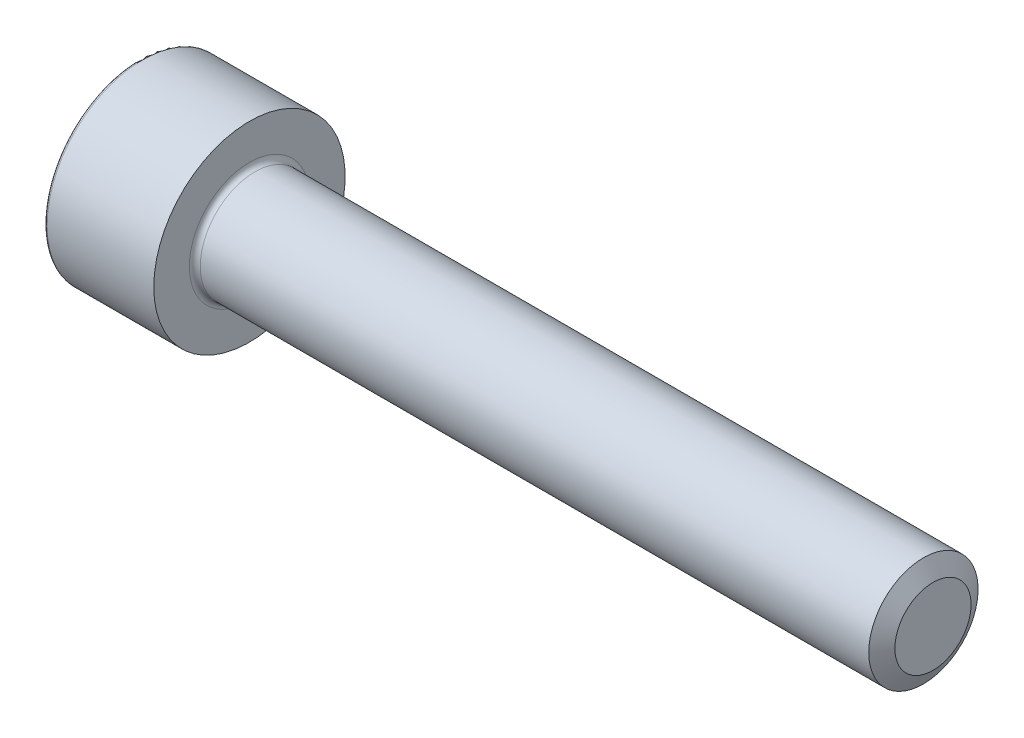
ISO-10303-21;
HEADER;
FILE_DESCRIPTION(('STEP AP214'),'2;1');
FILE_NAME('part.step','',(''),(''),'','','');
FILE_SCHEMA(('AUTOMOTIVE_DESIGN { 1 0 10303 214 1 1 1 1 }'));
ENDSEC;
DATA;
#1=APPLICATION_CONTEXT('core data for automotive mechanical design processes');
#2=APPLICATION_PROTOCOL_DEFINITION('international standard','automotive_design',2000,#1);
#3=PRODUCT_CONTEXT('',#1,'mechanical');
#4=PRODUCT('Part','Part','',(#3));
#5=PRODUCT_RELATED_PRODUCT_CATEGORY('part','',(#4));
#6=PRODUCT_DEFINITION_FORMATION('','',#4);
#7=PRODUCT_DEFINITION_CONTEXT('part definition',#1,'design');
#8=PRODUCT_DEFINITION('design','',#6,#7);
#9=PRODUCT_DEFINITION_SHAPE('','',#8);
#10=(LENGTH_UNIT() NAMED_UNIT(*) SI_UNIT(.MILLI.,.METRE.));
#11=(NAMED_UNIT(*) PLANE_ANGLE_UNIT() SI_UNIT($,.RADIAN.));
#12=(NAMED_UNIT(*) SI_UNIT($,.STERADIAN.) SOLID_ANGLE_UNIT());
#13=UNCERTAINTY_MEASURE_WITH_UNIT(LENGTH_MEASURE(1.E-05),#10,'distance_accuracy_value','');
#14=(GEOMETRIC_REPRESENTATION_CONTEXT(3) GLOBAL_UNCERTAINTY_ASSIGNED_CONTEXT((#13)) GLOBAL_UNIT_ASSIGNED_CONTEXT((#10,
#11,#12)) REPRESENTATION_CONTEXT('',''));
#15=CARTESIAN_POINT('',(0.,0.,0.));
#16=DIRECTION('',(0.,0.,1.));
#17=DIRECTION('',(1.,0.,0.));
#18=AXIS2_PLACEMENT_3D('',#15,#16,#17);
#19=CARTESIAN_POINT('',(0.,0.,0.));
#20=DIRECTION('',(-1.,0.,0.));
#21=DIRECTION('',(0.,0.,1.));
#22=AXIS2_PLACEMENT_3D('',#19,#20,#21);
#23=CYLINDRICAL_SURFACE('',#22,2.);
#24=CARTESIAN_POINT('',(4.2,0.,0.));
#25=DIRECTION('',(-1.,0.,0.));
#26=DIRECTION('',(0.,0.,1.));
#27=AXIS2_PLACEMENT_3D('',#24,#25,#26);
#28=CIRCLE('',#27,2.);
#29=CARTESIAN_POINT('',(4.2,0.,2.));
#30=VERTEX_POINT('',#29);
#31=EDGE_CURVE('E142',#30,#30,#28,.T.);
#32=ORIENTED_EDGE('',*,*,#31,.F.);
#33=EDGE_LOOP('',(#32));
#34=FACE_BOUND('',#33,.T.);
#35=CARTESIAN_POINT('',(28.6500102668172,0.,0.));
#36=DIRECTION('',(-1.,0.,0.));
#37=DIRECTION('',(0.,0.,1.));
#38=AXIS2_PLACEMENT_3D('',#35,#36,#37);
#39=CIRCLE('',#38,2.);
#40=CARTESIAN_POINT('',(28.6500102668172,0.,2.));
#41=VERTEX_POINT('',#40);
#42=EDGE_CURVE('E279',#41,#41,#39,.T.);
#43=ORIENTED_EDGE('',*,*,#42,.T.);
#44=EDGE_LOOP('',(#43));
#45=FACE_BOUND('',#44,.T.);
#46=ADVANCED_FACE('F39',(#34,#45),#23,.T.);
#47=CARTESIAN_POINT('',(0.,0.,0.));
#48=DIRECTION('',(1.,0.,0.));
#49=DIRECTION('',(0.,0.,-1.));
#50=AXIS2_PLACEMENT_3D('',#47,#48,#49);
#51=PLANE('',#50);
#52=CARTESIAN_POINT('',(0.,0.,0.));
#53=DIRECTION('',(1.,0.,0.));
#54=DIRECTION('',(0.,0.,-1.));
#55=AXIS2_PLACEMENT_3D('',#52,#53,#54);
#56=CIRCLE('',#55,3.4);
#57=CARTESIAN_POINT('',(0.,0.,-3.4));
#58=VERTEX_POINT('',#57);
#59=EDGE_CURVE('E47',#58,#58,#56,.F.);
#60=ORIENTED_EDGE('',*,*,#59,.T.);
#61=EDGE_LOOP('',(#60));
#62=FACE_BOUND('',#61,.T.);
#63=DIRECTION('',(0.,0.866025403784438,-0.5));
#64=VECTOR('',#63,1.);
#65=CARTESIAN_POINT('',(0.,0.,1.72));
#66=LINE('',#65,#64);
#67=CARTESIAN_POINT('',(0.,0.,1.72));
#68=VERTEX_POINT('',#67);
#69=CARTESIAN_POINT('',(0.,1.48956369450923,0.859999999999999));
#70=VERTEX_POINT('',#69);
#71=EDGE_CURVE('E128',#68,#70,#66,.T.);
#72=ORIENTED_EDGE('',*,*,#71,.F.);
#73=DIRECTION('',(0.,0.866025403784439,0.5));
#74=VECTOR('',#73,1.);
#75=CARTESIAN_POINT('',(0.,-1.48956369450923,0.86));
#76=LINE('',#75,#74);
#77=CARTESIAN_POINT('',(0.,-1.48956369450923,0.86));
#78=VERTEX_POINT('',#77);
#79=EDGE_CURVE('E54',#78,#68,#76,.T.);
#80=ORIENTED_EDGE('',*,*,#79,.F.);
#81=DIRECTION('',(0.,0.,1.));
#82=VECTOR('',#81,1.);
#83=CARTESIAN_POINT('',(0.,-1.48956369450923,-0.86));
#84=LINE('',#83,#82);
#85=CARTESIAN_POINT('',(0.,-1.48956369450923,-0.86));
#86=VERTEX_POINT('',#85);
#87=EDGE_CURVE('E138',#86,#78,#84,.T.);
#88=ORIENTED_EDGE('',*,*,#87,.F.);
#89=DIRECTION('',(0.,-0.866025403784438,0.5));
#90=VECTOR('',#89,1.);
#91=CARTESIAN_POINT('',(0.,0.,-1.72));
#92=LINE('',#91,#90);
#93=CARTESIAN_POINT('',(0.,0.,-1.72));
#94=VERTEX_POINT('',#93);
#95=EDGE_CURVE('E136',#94,#86,#92,.T.);
#96=ORIENTED_EDGE('',*,*,#95,.F.);
#97=DIRECTION('',(0.,-0.866025403784439,-0.5));
#98=VECTOR('',#97,1.);
#99=CARTESIAN_POINT('',(0.,1.48956369450923,-0.86));
#100=LINE('',#99,#98);
#101=CARTESIAN_POINT('',(0.,1.48956369450923,-0.86));
#102=VERTEX_POINT('',#101);
#103=EDGE_CURVE('E102',#102,#94,#100,.T.);
#104=ORIENTED_EDGE('',*,*,#103,.F.);
#105=DIRECTION('',(0.,0.,-1.));
#106=VECTOR('',#105,1.);
#107=CARTESIAN_POINT('',(0.,1.48956369450923,0.859999999999999));
#108=LINE('',#107,#106);
#109=EDGE_CURVE('E132',#70,#102,#108,.T.);
#110=ORIENTED_EDGE('',*,*,#109,.F.);
#111=EDGE_LOOP('',(#72,#80,#88,#96,#104,#110));
#112=FACE_BOUND('',#111,.T.);
#113=ADVANCED_FACE('F159',(#62,#112),#51,.F.);
#114=CARTESIAN_POINT('',(0.,0.,0.));
#115=DIRECTION('',(-1.,0.,0.));
#116=DIRECTION('',(0.,0.,1.));
#117=AXIS2_PLACEMENT_3D('',#114,#115,#116);
#118=CYLINDRICAL_SURFACE('',#117,3.5);
#119=CARTESIAN_POINT('',(0.1,0.,0.));
#120=DIRECTION('',(1.,0.,0.));
#121=DIRECTION('',(0.,0.,-1.));
#122=AXIS2_PLACEMENT_3D('',#119,#120,#121);
#123=CIRCLE('',#122,3.5);
#124=CARTESIAN_POINT('',(0.1,0.,-3.5));
#125=VERTEX_POINT('',#124);
#126=EDGE_CURVE('E11',#125,#125,#123,.T.);
#127=ORIENTED_EDGE('',*,*,#126,.T.);
#128=EDGE_LOOP('',(#127));
#129=FACE_BOUND('',#128,.T.);
#130=CARTESIAN_POINT('',(4.,0.,0.));
#131=DIRECTION('',(-1.,0.,0.));
#132=DIRECTION('',(0.,0.,1.));
#133=AXIS2_PLACEMENT_3D('',#130,#131,#132);
#134=CIRCLE('',#133,3.5);
#135=CARTESIAN_POINT('',(4.,0.,3.5));
#136=VERTEX_POINT('',#135);
#137=EDGE_CURVE('E153',#136,#136,#134,.T.);
#138=ORIENTED_EDGE('',*,*,#137,.T.);
#139=EDGE_LOOP('',(#138));
#140=FACE_BOUND('',#139,.T.);
#141=ADVANCED_FACE('F178',(#129,#140),#118,.T.);
#142=CARTESIAN_POINT('',(4.,3.5,0.));
#143=DIRECTION('',(-1.,0.,0.));
#144=DIRECTION('',(0.,0.,1.));
#145=AXIS2_PLACEMENT_3D('',#142,#143,#144);
#146=PLANE('',#145);
#147=ORIENTED_EDGE('',*,*,#137,.F.);
#148=EDGE_LOOP('',(#147));
#149=FACE_BOUND('',#148,.T.);
#150=CARTESIAN_POINT('',(4.,0.,0.));
#151=DIRECTION('',(-1.,0.,0.));
#152=DIRECTION('',(0.,0.,1.));
#153=AXIS2_PLACEMENT_3D('',#150,#151,#152);
#154=CIRCLE('',#153,2.2);
#155=CARTESIAN_POINT('',(4.,0.,2.2));
#156=VERTEX_POINT('',#155);
#157=EDGE_CURVE('E150',#156,#156,#154,.T.);
#158=ORIENTED_EDGE('',*,*,#157,.T.);
#159=EDGE_LOOP('',(#158));
#160=FACE_BOUND('',#159,.T.);
#161=ADVANCED_FACE('F187',(#149,#160),#146,.F.);
#162=CARTESIAN_POINT('',(4.2,0.,0.));
#163=DIRECTION('',(-1.,0.,0.));
#164=DIRECTION('',(0.,0.,1.));
#165=AXIS2_PLACEMENT_3D('',#162,#163,#164);
#166=TOROIDAL_SURFACE('',#165,2.2,0.2);
#167=ORIENTED_EDGE('',*,*,#157,.F.);
#168=EDGE_LOOP('',(#167));
#169=FACE_BOUND('',#168,.T.);
#170=ORIENTED_EDGE('',*,*,#31,.T.);
#171=EDGE_LOOP('',(#170));
#172=FACE_BOUND('',#171,.T.);
#173=ADVANCED_FACE('F183',(#169,#172),#166,.F.);
#174=CARTESIAN_POINT('',(2.,-1.48956369450923,0.86));
#175=DIRECTION('',(0.,-0.5,0.866025403784439));
#176=DIRECTION('',(0.,-0.866025403784439,-0.5));
#177=AXIS2_PLACEMENT_3D('',#174,#175,#176);
#178=PLANE('',#177);
#179=ORIENTED_EDGE('',*,*,#79,.T.);
#180=DIRECTION('',(-1.,0.,0.));
#181=VECTOR('',#180,1.);
#182=CARTESIAN_POINT('',(2.,0.,1.72));
#183=LINE('',#182,#181);
#184=CARTESIAN_POINT('',(2.,0.,1.72));
#185=VERTEX_POINT('',#184);
#186=EDGE_CURVE('E84',#185,#68,#183,.T.);
#187=ORIENTED_EDGE('',*,*,#186,.F.);
#188=DIRECTION('',(0.,0.866025403784439,0.5));
#189=VECTOR('',#188,1.);
#190=CARTESIAN_POINT('',(2.,-1.48956369450923,0.86));
#191=LINE('',#190,#189);
#192=CARTESIAN_POINT('',(2.,-1.48956369450923,0.86));
#193=VERTEX_POINT('',#192);
#194=EDGE_CURVE('E140',#193,#185,#191,.T.);
#195=ORIENTED_EDGE('',*,*,#194,.F.);
#196=DIRECTION('',(-1.,0.,0.));
#197=VECTOR('',#196,1.);
#198=CARTESIAN_POINT('',(2.,-1.48956369450923,0.86));
#199=LINE('',#198,#197);
#200=EDGE_CURVE('E62',#193,#78,#199,.T.);
#201=ORIENTED_EDGE('',*,*,#200,.T.);
#202=EDGE_LOOP('',(#179,#187,#195,#201));
#203=FACE_BOUND('',#202,.T.);
#204=ADVANCED_FACE('F186',(#203),#178,.F.);
#205=CARTESIAN_POINT('',(2.,-1.48956369450923,-0.86));
#206=DIRECTION('',(0.,-1.,0.));
#207=DIRECTION('',(0.,0.,-1.));
#208=AXIS2_PLACEMENT_3D('',#205,#206,#207);
#209=PLANE('',#208);
#210=ORIENTED_EDGE('',*,*,#87,.T.);
#211=ORIENTED_EDGE('',*,*,#200,.F.);
#212=DIRECTION('',(0.,0.,1.));
#213=VECTOR('',#212,1.);
#214=CARTESIAN_POINT('',(2.,-1.48956369450923,-0.86));
#215=LINE('',#214,#213);
#216=CARTESIAN_POINT('',(2.,-1.48956369450923,-0.86));
#217=VERTEX_POINT('',#216);
#218=EDGE_CURVE('E114',#217,#193,#215,.T.);
#219=ORIENTED_EDGE('',*,*,#218,.F.);
#220=DIRECTION('',(-1.,0.,0.));
#221=VECTOR('',#220,1.);
#222=CARTESIAN_POINT('',(2.,-1.48956369450923,-0.86));
#223=LINE('',#222,#221);
#224=EDGE_CURVE('E106',#217,#86,#223,.T.);
#225=ORIENTED_EDGE('',*,*,#224,.T.);
#226=EDGE_LOOP('',(#210,#211,#219,#225));
#227=FACE_BOUND('',#226,.T.);
#228=ADVANCED_FACE('F217',(#227),#209,.F.);
#229=CARTESIAN_POINT('',(2.,0.,-1.72));
#230=DIRECTION('',(0.,-0.5,-0.866025403784439));
#231=DIRECTION('',(0.,0.866025403784438,-0.5));
#232=AXIS2_PLACEMENT_3D('',#229,#230,#231);
#233=PLANE('',#232);
#234=ORIENTED_EDGE('',*,*,#95,.T.);
#235=ORIENTED_EDGE('',*,*,#224,.F.);
#236=DIRECTION('',(0.,-0.866025403784438,0.5));
#237=VECTOR('',#236,1.);
#238=CARTESIAN_POINT('',(2.,0.,-1.72));
#239=LINE('',#238,#237);
#240=CARTESIAN_POINT('',(2.,0.,-1.72));
#241=VERTEX_POINT('',#240);
#242=EDGE_CURVE('E110',#241,#217,#239,.T.);
#243=ORIENTED_EDGE('',*,*,#242,.F.);
#244=DIRECTION('',(-1.,0.,0.));
#245=VECTOR('',#244,1.);
#246=CARTESIAN_POINT('',(2.,0.,-1.72));
#247=LINE('',#246,#245);
#248=EDGE_CURVE('E95',#241,#94,#247,.T.);
#249=ORIENTED_EDGE('',*,*,#248,.T.);
#250=EDGE_LOOP('',(#234,#235,#243,#249));
#251=FACE_BOUND('',#250,.T.);
#252=ADVANCED_FACE('F111',(#251),#233,.F.);
#253=CARTESIAN_POINT('',(2.,1.48956369450923,-0.86));
#254=DIRECTION('',(0.,0.5,-0.866025403784439));
#255=DIRECTION('',(0.,0.866025403784439,0.5));
#256=AXIS2_PLACEMENT_3D('',#253,#254,#255);
#257=PLANE('',#256);
#258=ORIENTED_EDGE('',*,*,#103,.T.);
#259=ORIENTED_EDGE('',*,*,#248,.F.);
#260=DIRECTION('',(0.,-0.866025403784439,-0.5));
#261=VECTOR('',#260,1.);
#262=CARTESIAN_POINT('',(2.,1.48956369450923,-0.86));
#263=LINE('',#262,#261);
#264=CARTESIAN_POINT('',(2.,1.48956369450923,-0.86));
#265=VERTEX_POINT('',#264);
#266=EDGE_CURVE('E99',#265,#241,#263,.T.);
#267=ORIENTED_EDGE('',*,*,#266,.F.);
#268=DIRECTION('',(-1.,0.,0.));
#269=VECTOR('',#268,1.);
#270=CARTESIAN_POINT('',(2.,1.48956369450923,-0.86));
#271=LINE('',#270,#269);
#272=EDGE_CURVE('E107',#265,#102,#271,.T.);
#273=ORIENTED_EDGE('',*,*,#272,.T.);
#274=EDGE_LOOP('',(#258,#259,#267,#273));
#275=FACE_BOUND('',#274,.T.);
#276=ADVANCED_FACE('F97',(#275),#257,.F.);
#277=CARTESIAN_POINT('',(2.,1.48956369450923,0.859999999999999));
#278=DIRECTION('',(0.,1.,0.));
#279=DIRECTION('',(0.,0.,1.));
#280=AXIS2_PLACEMENT_3D('',#277,#278,#279);
#281=PLANE('',#280);
#282=ORIENTED_EDGE('',*,*,#109,.T.);
#283=ORIENTED_EDGE('',*,*,#272,.F.);
#284=DIRECTION('',(0.,0.,-1.));
#285=VECTOR('',#284,1.);
#286=CARTESIAN_POINT('',(2.,1.48956369450923,0.859999999999999));
#287=LINE('',#286,#285);
#288=CARTESIAN_POINT('',(2.,1.48956369450923,0.859999999999999));
#289=VERTEX_POINT('',#288);
#290=EDGE_CURVE('E120',#289,#265,#287,.T.);
#291=ORIENTED_EDGE('',*,*,#290,.F.);
#292=DIRECTION('',(-1.,0.,0.));
#293=VECTOR('',#292,1.);
#294=CARTESIAN_POINT('',(2.,1.48956369450923,0.859999999999999));
#295=LINE('',#294,#293);
#296=EDGE_CURVE('E145',#289,#70,#295,.T.);
#297=ORIENTED_EDGE('',*,*,#296,.T.);
#298=EDGE_LOOP('',(#282,#283,#291,#297));
#299=FACE_BOUND('',#298,.T.);
#300=ADVANCED_FACE('F235',(#299),#281,.F.);
#301=CARTESIAN_POINT('',(2.,0.,1.72));
#302=DIRECTION('',(0.,0.5,0.866025403784439));
#303=DIRECTION('',(0.,-0.866025403784438,0.5));
#304=AXIS2_PLACEMENT_3D('',#301,#302,#303);
#305=PLANE('',#304);
#306=ORIENTED_EDGE('',*,*,#71,.T.);
#307=ORIENTED_EDGE('',*,*,#296,.F.);
#308=DIRECTION('',(0.,0.866025403784438,-0.5));
#309=VECTOR('',#308,1.);
#310=CARTESIAN_POINT('',(2.,0.,1.72));
#311=LINE('',#310,#309);
#312=EDGE_CURVE('E122',#185,#289,#311,.T.);
#313=ORIENTED_EDGE('',*,*,#312,.F.);
#314=ORIENTED_EDGE('',*,*,#186,.T.);
#315=EDGE_LOOP('',(#306,#307,#313,#314));
#316=FACE_BOUND('',#315,.T.);
#317=ADVANCED_FACE('F242',(#316),#305,.F.);
#318=CARTESIAN_POINT('',(2.,1.48956369450923,2.58));
#319=DIRECTION('',(-1.,0.,0.));
#320=DIRECTION('',(0.,0.,1.));
#321=AXIS2_PLACEMENT_3D('',#318,#319,#320);
#322=PLANE('',#321);
#323=ORIENTED_EDGE('',*,*,#194,.T.);
#324=ORIENTED_EDGE('',*,*,#312,.T.);
#325=ORIENTED_EDGE('',*,*,#290,.T.);
#326=ORIENTED_EDGE('',*,*,#266,.T.);
#327=ORIENTED_EDGE('',*,*,#242,.T.);
#328=ORIENTED_EDGE('',*,*,#218,.T.);
#329=EDGE_LOOP('',(#323,#324,#325,#326,#327,#328));
#330=FACE_BOUND('',#329,.T.);
#331=ADVANCED_FACE('F117',(#330),#322,.T.);
#332=CARTESIAN_POINT('',(28.6500102668172,0.,0.));
#333=DIRECTION('',(-1.,0.,0.));
#334=DIRECTION('',(0.,0.,1.));
#335=AXIS2_PLACEMENT_3D('',#332,#333,#334);
#336=CONICAL_SURFACE('',#335,2.,1.04719755119659);
#337=CARTESIAN_POINT('',(29.,0.,0.));
#338=DIRECTION('',(-1.,0.,0.));
#339=DIRECTION('',(0.,0.,1.));
#340=AXIS2_PLACEMENT_3D('',#337,#338,#339);
#341=CIRCLE('',#340,1.3938);
#342=CARTESIAN_POINT('',(29.,0.,1.3938));
#343=VERTEX_POINT('',#342);
#344=EDGE_CURVE('E129',#343,#343,#341,.T.);
#345=ORIENTED_EDGE('',*,*,#344,.T.);
#346=EDGE_LOOP('',(#345));
#347=FACE_BOUND('',#346,.T.);
#348=ORIENTED_EDGE('',*,*,#42,.F.);
#349=EDGE_LOOP('',(#348));
#350=FACE_BOUND('',#349,.T.);
#351=ADVANCED_FACE('F168',(#347,#350),#336,.T.);
#352=CARTESIAN_POINT('',(29.,2.,0.));
#353=DIRECTION('',(-1.,0.,0.));
#354=DIRECTION('',(0.,0.,1.));
#355=AXIS2_PLACEMENT_3D('',#352,#353,#354);
#356=PLANE('',#355);
#357=ORIENTED_EDGE('',*,*,#344,.F.);
#358=EDGE_LOOP('',(#357));
#359=FACE_BOUND('',#358,.T.);
#360=ADVANCED_FACE('F163',(#359),#356,.F.);
#361=CARTESIAN_POINT('',(0.1,0.,0.));
#362=DIRECTION('',(1.,0.,0.));
#363=DIRECTION('',(0.,0.,-1.));
#364=AXIS2_PLACEMENT_3D('',#361,#362,#363);
#365=TOROIDAL_SURFACE('',#364,3.4,0.1);
#366=ORIENTED_EDGE('',*,*,#126,.F.);
#367=EDGE_LOOP('',(#366));
#368=FACE_BOUND('',#367,.T.);
#369=ORIENTED_EDGE('',*,*,#59,.F.);
#370=EDGE_LOOP('',(#369));
#371=FACE_BOUND('',#370,.T.);
#372=ADVANCED_FACE('F41',(#368,#371),#365,.T.);
#373=CLOSED_SHELL('',(#46,#113,#141,#161,#173,#204,#228,#252,#276,#300,#317,#331,#351,#360,#372));
#374=MANIFOLD_SOLID_BREP('B2',#373);
#375=ADVANCED_BREP_SHAPE_REPRESENTATION('',(#18,#374),#14);
#376=SHAPE_DEFINITION_REPRESENTATION(#9,#375);
ENDSEC;
END-ISO-10303-21;
